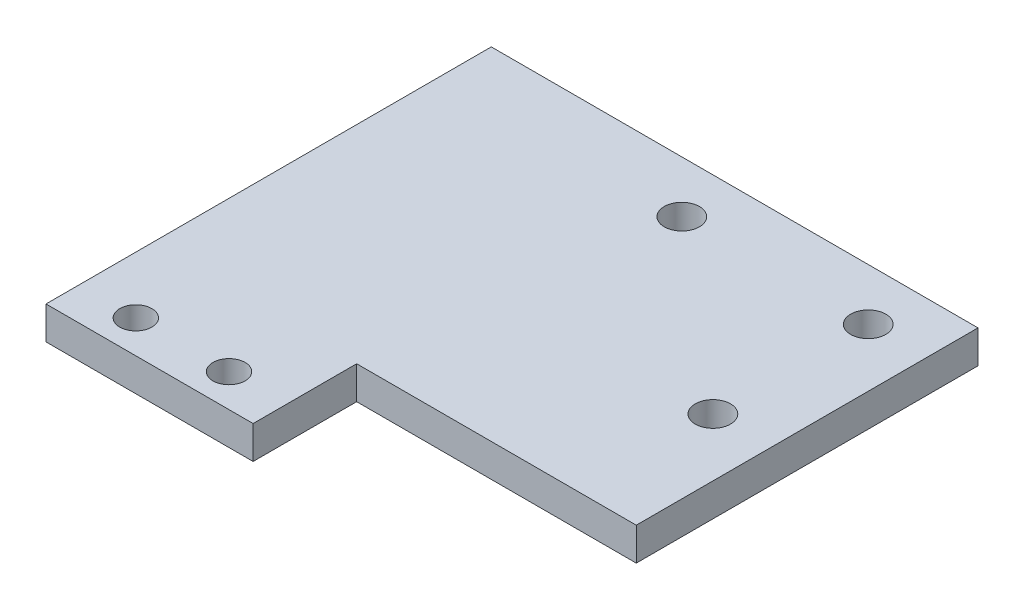
ISO-10303-21;
HEADER;
FILE_DESCRIPTION(('STEP AP214'),'2;1');
FILE_NAME('part.step','',(''),(''),'','','');
FILE_SCHEMA(('AUTOMOTIVE_DESIGN { 1 0 10303 214 1 1 1 1 }'));
ENDSEC;
DATA;
#1=APPLICATION_CONTEXT('core data for automotive mechanical design processes');
#2=APPLICATION_PROTOCOL_DEFINITION('international standard','automotive_design',2000,#1);
#3=PRODUCT_CONTEXT('',#1,'mechanical');
#4=PRODUCT('Part','Part','',(#3));
#5=PRODUCT_RELATED_PRODUCT_CATEGORY('part','',(#4));
#6=PRODUCT_DEFINITION_FORMATION('','',#4);
#7=PRODUCT_DEFINITION_CONTEXT('part definition',#1,'design');
#8=PRODUCT_DEFINITION('design','',#6,#7);
#9=PRODUCT_DEFINITION_SHAPE('','',#8);
#10=(LENGTH_UNIT() NAMED_UNIT(*) SI_UNIT(.MILLI.,.METRE.));
#11=(NAMED_UNIT(*) PLANE_ANGLE_UNIT() SI_UNIT($,.RADIAN.));
#12=(NAMED_UNIT(*) SI_UNIT($,.STERADIAN.) SOLID_ANGLE_UNIT());
#13=UNCERTAINTY_MEASURE_WITH_UNIT(LENGTH_MEASURE(1.E-05),#10,'distance_accuracy_value','');
#14=(GEOMETRIC_REPRESENTATION_CONTEXT(3) GLOBAL_UNCERTAINTY_ASSIGNED_CONTEXT((#13)) GLOBAL_UNIT_ASSIGNED_CONTEXT((#10,
#11,#12)) REPRESENTATION_CONTEXT('',''));
#15=CARTESIAN_POINT('',(0.,0.,0.));
#16=DIRECTION('',(0.,0.,1.));
#17=DIRECTION('',(1.,0.,0.));
#18=AXIS2_PLACEMENT_3D('',#15,#16,#17);
#19=CARTESIAN_POINT('',(0.,3.175,0.));
#20=DIRECTION('',(0.,-1.,0.));
#21=DIRECTION('',(0.,0.,-1.));
#22=AXIS2_PLACEMENT_3D('',#19,#20,#21);
#23=PLANE('',#22);
#24=DIRECTION('',(1.,0.,0.));
#25=VECTOR('',#24,1.);
#26=CARTESIAN_POINT('',(0.,3.175,0.));
#27=LINE('',#26,#25);
#28=CARTESIAN_POINT('',(0.,3.175,0.));
#29=VERTEX_POINT('',#28);
#30=CARTESIAN_POINT('',(19.9999999999988,3.175,0.));
#31=VERTEX_POINT('',#30);
#32=EDGE_CURVE('E135',#29,#31,#27,.T.);
#33=ORIENTED_EDGE('',*,*,#32,.T.);
#34=DIRECTION('',(0.,0.,-1.));
#35=VECTOR('',#34,1.);
#36=CARTESIAN_POINT('',(19.999999999999,3.175,-10.));
#37=LINE('',#36,#35);
#38=CARTESIAN_POINT('',(19.999999999999,3.175,-10.));
#39=VERTEX_POINT('',#38);
#40=EDGE_CURVE('E93',#31,#39,#37,.T.);
#41=ORIENTED_EDGE('',*,*,#40,.T.);
#42=DIRECTION('',(1.,0.,0.));
#43=VECTOR('',#42,1.);
#44=CARTESIAN_POINT('',(47.,3.175,-10.));
#45=LINE('',#44,#43);
#46=CARTESIAN_POINT('',(47.,3.175,-10.));
#47=VERTEX_POINT('',#46);
#48=EDGE_CURVE('E106',#39,#47,#45,.T.);
#49=ORIENTED_EDGE('',*,*,#48,.T.);
#50=DIRECTION('',(0.,0.,-1.));
#51=VECTOR('',#50,1.);
#52=CARTESIAN_POINT('',(47.,3.175,-43.));
#53=LINE('',#52,#51);
#54=CARTESIAN_POINT('',(47.,3.175,-43.));
#55=VERTEX_POINT('',#54);
#56=EDGE_CURVE('E100',#47,#55,#53,.T.);
#57=ORIENTED_EDGE('',*,*,#56,.T.);
#58=DIRECTION('',(-1.,0.,0.));
#59=VECTOR('',#58,1.);
#60=CARTESIAN_POINT('',(0.,3.175,-43.));
#61=LINE('',#60,#59);
#62=CARTESIAN_POINT('',(0.,3.175,-43.));
#63=VERTEX_POINT('',#62);
#64=EDGE_CURVE('E104',#55,#63,#61,.T.);
#65=ORIENTED_EDGE('',*,*,#64,.T.);
#66=DIRECTION('',(0.,0.,1.));
#67=VECTOR('',#66,1.);
#68=CARTESIAN_POINT('',(0.,3.175,0.));
#69=LINE('',#68,#67);
#70=EDGE_CURVE('E56',#63,#29,#69,.T.);
#71=ORIENTED_EDGE('',*,*,#70,.T.);
#72=EDGE_LOOP('',(#33,#41,#49,#57,#65,#71));
#73=FACE_BOUND('',#72,.T.);
#74=CARTESIAN_POINT('',(41.399999999998,3.175,-23.));
#75=DIRECTION('',(0.,1.,0.));
#76=DIRECTION('',(0.,0.,1.));
#77=AXIS2_PLACEMENT_3D('',#74,#75,#76);
#78=CIRCLE('',#77,1.69999999999997);
#79=CARTESIAN_POINT('',(41.399999999998,3.175,-21.3));
#80=VERTEX_POINT('',#79);
#81=EDGE_CURVE('E128',#80,#80,#78,.T.);
#82=ORIENTED_EDGE('',*,*,#81,.F.);
#83=EDGE_LOOP('',(#82));
#84=FACE_BOUND('',#83,.T.);
#85=CARTESIAN_POINT('',(41.399999999998,3.175,-38.));
#86=DIRECTION('',(0.,1.,0.));
#87=DIRECTION('',(0.,0.,1.));
#88=AXIS2_PLACEMENT_3D('',#85,#86,#87);
#89=CIRCLE('',#88,1.69999999999997);
#90=CARTESIAN_POINT('',(41.399999999998,3.175,-36.3));
#91=VERTEX_POINT('',#90);
#92=EDGE_CURVE('E209',#91,#91,#89,.T.);
#93=ORIENTED_EDGE('',*,*,#92,.F.);
#94=EDGE_LOOP('',(#93));
#95=FACE_BOUND('',#94,.T.);
#96=CARTESIAN_POINT('',(23.3999999999979,3.175,-38.));
#97=DIRECTION('',(0.,1.,0.));
#98=DIRECTION('',(0.,0.,1.));
#99=AXIS2_PLACEMENT_3D('',#96,#97,#98);
#100=CIRCLE('',#99,1.69999999999997);
#101=CARTESIAN_POINT('',(23.3999999999979,3.175,-36.3));
#102=VERTEX_POINT('',#101);
#103=EDGE_CURVE('E203',#102,#102,#100,.T.);
#104=ORIENTED_EDGE('',*,*,#103,.F.);
#105=EDGE_LOOP('',(#104));
#106=FACE_BOUND('',#105,.T.);
#107=CARTESIAN_POINT('',(14.4999999999994,3.175,-3.175));
#108=DIRECTION('',(0.,1.,0.));
#109=DIRECTION('',(0.,0.,1.));
#110=AXIS2_PLACEMENT_3D('',#107,#108,#109);
#111=CIRCLE('',#110,1.55);
#112=CARTESIAN_POINT('',(14.4999999999994,3.175,-1.625));
#113=VERTEX_POINT('',#112);
#114=EDGE_CURVE('E197',#113,#113,#111,.T.);
#115=ORIENTED_EDGE('',*,*,#114,.F.);
#116=EDGE_LOOP('',(#115));
#117=FACE_BOUND('',#116,.T.);
#118=CARTESIAN_POINT('',(5.49999999999938,3.175,-3.175));
#119=DIRECTION('',(0.,1.,0.));
#120=DIRECTION('',(0.,0.,1.));
#121=AXIS2_PLACEMENT_3D('',#118,#119,#120);
#122=CIRCLE('',#121,1.55);
#123=CARTESIAN_POINT('',(5.49999999999938,3.175,-1.625));
#124=VERTEX_POINT('',#123);
#125=EDGE_CURVE('E188',#124,#124,#122,.T.);
#126=ORIENTED_EDGE('',*,*,#125,.F.);
#127=EDGE_LOOP('',(#126));
#128=FACE_BOUND('',#127,.T.);
#129=ADVANCED_FACE('F39',(#73,#84,#95,#106,#117,#128),#23,.F.);
#130=CARTESIAN_POINT('',(0.,0.,0.));
#131=DIRECTION('',(0.,-1.,0.));
#132=DIRECTION('',(0.,0.,-1.));
#133=AXIS2_PLACEMENT_3D('',#130,#131,#132);
#134=PLANE('',#133);
#135=CARTESIAN_POINT('',(14.4999999999994,0.,-3.175));
#136=DIRECTION('',(0.,1.,0.));
#137=DIRECTION('',(0.,0.,1.));
#138=AXIS2_PLACEMENT_3D('',#135,#136,#137);
#139=CIRCLE('',#138,1.55);
#140=CARTESIAN_POINT('',(14.4999999999994,0.,-1.625));
#141=VERTEX_POINT('',#140);
#142=EDGE_CURVE('E194',#141,#141,#139,.T.);
#143=ORIENTED_EDGE('',*,*,#142,.T.);
#144=EDGE_LOOP('',(#143));
#145=FACE_BOUND('',#144,.T.);
#146=CARTESIAN_POINT('',(41.399999999998,0.,-38.));
#147=DIRECTION('',(0.,1.,0.));
#148=DIRECTION('',(0.,0.,1.));
#149=AXIS2_PLACEMENT_3D('',#146,#147,#148);
#150=CIRCLE('',#149,1.69999999999997);
#151=CARTESIAN_POINT('',(41.399999999998,0.,-36.3));
#152=VERTEX_POINT('',#151);
#153=EDGE_CURVE('E206',#152,#152,#150,.T.);
#154=ORIENTED_EDGE('',*,*,#153,.T.);
#155=EDGE_LOOP('',(#154));
#156=FACE_BOUND('',#155,.T.);
#157=DIRECTION('',(1.,0.,0.));
#158=VECTOR('',#157,1.);
#159=CARTESIAN_POINT('',(0.,0.,0.));
#160=LINE('',#159,#158);
#161=CARTESIAN_POINT('',(0.,0.,0.));
#162=VERTEX_POINT('',#161);
#163=CARTESIAN_POINT('',(19.9999999999988,0.,0.));
#164=VERTEX_POINT('',#163);
#165=EDGE_CURVE('E124',#162,#164,#160,.T.);
#166=ORIENTED_EDGE('',*,*,#165,.F.);
#167=DIRECTION('',(0.,0.,1.));
#168=VECTOR('',#167,1.);
#169=CARTESIAN_POINT('',(0.,0.,0.));
#170=LINE('',#169,#168);
#171=CARTESIAN_POINT('',(0.,0.,-43.));
#172=VERTEX_POINT('',#171);
#173=EDGE_CURVE('E85',#172,#162,#170,.T.);
#174=ORIENTED_EDGE('',*,*,#173,.F.);
#175=DIRECTION('',(-1.,0.,0.));
#176=VECTOR('',#175,1.);
#177=CARTESIAN_POINT('',(0.,0.,-43.));
#178=LINE('',#177,#176);
#179=CARTESIAN_POINT('',(47.,0.,-43.));
#180=VERTEX_POINT('',#179);
#181=EDGE_CURVE('E79',#180,#172,#178,.T.);
#182=ORIENTED_EDGE('',*,*,#181,.F.);
#183=DIRECTION('',(0.,0.,-1.));
#184=VECTOR('',#183,1.);
#185=CARTESIAN_POINT('',(47.,0.,-43.));
#186=LINE('',#185,#184);
#187=CARTESIAN_POINT('',(47.,0.,-10.));
#188=VERTEX_POINT('',#187);
#189=EDGE_CURVE('E114',#188,#180,#186,.T.);
#190=ORIENTED_EDGE('',*,*,#189,.F.);
#191=DIRECTION('',(1.,0.,0.));
#192=VECTOR('',#191,1.);
#193=CARTESIAN_POINT('',(47.,0.,-10.));
#194=LINE('',#193,#192);
#195=CARTESIAN_POINT('',(19.999999999999,0.,-10.));
#196=VERTEX_POINT('',#195);
#197=EDGE_CURVE('E130',#196,#188,#194,.T.);
#198=ORIENTED_EDGE('',*,*,#197,.F.);
#199=DIRECTION('',(0.,0.,-1.));
#200=VECTOR('',#199,1.);
#201=CARTESIAN_POINT('',(19.999999999999,0.,-10.));
#202=LINE('',#201,#200);
#203=EDGE_CURVE('E127',#164,#196,#202,.T.);
#204=ORIENTED_EDGE('',*,*,#203,.F.);
#205=EDGE_LOOP('',(#166,#174,#182,#190,#198,#204));
#206=FACE_BOUND('',#205,.T.);
#207=CARTESIAN_POINT('',(41.399999999998,0.,-23.));
#208=DIRECTION('',(0.,1.,0.));
#209=DIRECTION('',(0.,0.,1.));
#210=AXIS2_PLACEMENT_3D('',#207,#208,#209);
#211=CIRCLE('',#210,1.69999999999997);
#212=CARTESIAN_POINT('',(41.399999999998,0.,-21.3));
#213=VERTEX_POINT('',#212);
#214=EDGE_CURVE('E212',#213,#213,#211,.T.);
#215=ORIENTED_EDGE('',*,*,#214,.T.);
#216=EDGE_LOOP('',(#215));
#217=FACE_BOUND('',#216,.T.);
#218=CARTESIAN_POINT('',(23.3999999999979,0.,-38.));
#219=DIRECTION('',(0.,1.,0.));
#220=DIRECTION('',(0.,0.,1.));
#221=AXIS2_PLACEMENT_3D('',#218,#219,#220);
#222=CIRCLE('',#221,1.69999999999997);
#223=CARTESIAN_POINT('',(23.3999999999979,0.,-36.3));
#224=VERTEX_POINT('',#223);
#225=EDGE_CURVE('E200',#224,#224,#222,.T.);
#226=ORIENTED_EDGE('',*,*,#225,.T.);
#227=EDGE_LOOP('',(#226));
#228=FACE_BOUND('',#227,.T.);
#229=CARTESIAN_POINT('',(5.49999999999938,0.,-3.175));
#230=DIRECTION('',(0.,1.,0.));
#231=DIRECTION('',(0.,0.,1.));
#232=AXIS2_PLACEMENT_3D('',#229,#230,#231);
#233=CIRCLE('',#232,1.55);
#234=CARTESIAN_POINT('',(5.49999999999938,0.,-1.625));
#235=VERTEX_POINT('',#234);
#236=EDGE_CURVE('E191',#235,#235,#233,.T.);
#237=ORIENTED_EDGE('',*,*,#236,.T.);
#238=EDGE_LOOP('',(#237));
#239=FACE_BOUND('',#238,.T.);
#240=ADVANCED_FACE('F144',(#145,#156,#206,#217,#228,#239),#134,.T.);
#241=CARTESIAN_POINT('',(0.,3.175,0.));
#242=DIRECTION('',(0.,0.,-1.));
#243=DIRECTION('',(-1.,0.,0.));
#244=AXIS2_PLACEMENT_3D('',#241,#242,#243);
#245=PLANE('',#244);
#246=ORIENTED_EDGE('',*,*,#165,.T.);
#247=DIRECTION('',(0.,-1.,0.));
#248=VECTOR('',#247,1.);
#249=CARTESIAN_POINT('',(19.9999999999988,3.175,0.));
#250=LINE('',#249,#248);
#251=EDGE_CURVE('E11',#31,#164,#250,.T.);
#252=ORIENTED_EDGE('',*,*,#251,.F.);
#253=ORIENTED_EDGE('',*,*,#32,.F.);
#254=DIRECTION('',(0.,-1.,0.));
#255=VECTOR('',#254,1.);
#256=CARTESIAN_POINT('',(0.,3.175,0.));
#257=LINE('',#256,#255);
#258=EDGE_CURVE('E120',#29,#162,#257,.T.);
#259=ORIENTED_EDGE('',*,*,#258,.T.);
#260=EDGE_LOOP('',(#246,#252,#253,#259));
#261=FACE_BOUND('',#260,.T.);
#262=ADVANCED_FACE('F41',(#261),#245,.F.);
#263=CARTESIAN_POINT('',(19.999999999999,3.175,-10.));
#264=DIRECTION('',(-1.,0.,0.));
#265=DIRECTION('',(0.,0.,1.));
#266=AXIS2_PLACEMENT_3D('',#263,#264,#265);
#267=PLANE('',#266);
#268=ORIENTED_EDGE('',*,*,#203,.T.);
#269=DIRECTION('',(0.,-1.,0.));
#270=VECTOR('',#269,1.);
#271=CARTESIAN_POINT('',(19.999999999999,3.175,-10.));
#272=LINE('',#271,#270);
#273=EDGE_CURVE('E48',#39,#196,#272,.T.);
#274=ORIENTED_EDGE('',*,*,#273,.F.);
#275=ORIENTED_EDGE('',*,*,#40,.F.);
#276=ORIENTED_EDGE('',*,*,#251,.T.);
#277=EDGE_LOOP('',(#268,#274,#275,#276));
#278=FACE_BOUND('',#277,.T.);
#279=ADVANCED_FACE('F285',(#278),#267,.F.);
#280=CARTESIAN_POINT('',(47.,3.175,-10.));
#281=DIRECTION('',(0.,0.,-1.));
#282=DIRECTION('',(-1.,0.,0.));
#283=AXIS2_PLACEMENT_3D('',#280,#281,#282);
#284=PLANE('',#283);
#285=ORIENTED_EDGE('',*,*,#197,.T.);
#286=DIRECTION('',(0.,-1.,0.));
#287=VECTOR('',#286,1.);
#288=CARTESIAN_POINT('',(47.,3.175,-10.));
#289=LINE('',#288,#287);
#290=EDGE_CURVE('E115',#47,#188,#289,.T.);
#291=ORIENTED_EDGE('',*,*,#290,.F.);
#292=ORIENTED_EDGE('',*,*,#48,.F.);
#293=ORIENTED_EDGE('',*,*,#273,.T.);
#294=EDGE_LOOP('',(#285,#291,#292,#293));
#295=FACE_BOUND('',#294,.T.);
#296=ADVANCED_FACE('F141',(#295),#284,.F.);
#297=CARTESIAN_POINT('',(47.,3.175,-43.));
#298=DIRECTION('',(-1.,0.,0.));
#299=DIRECTION('',(0.,0.,1.));
#300=AXIS2_PLACEMENT_3D('',#297,#298,#299);
#301=PLANE('',#300);
#302=ORIENTED_EDGE('',*,*,#189,.T.);
#303=DIRECTION('',(0.,-1.,0.));
#304=VECTOR('',#303,1.);
#305=CARTESIAN_POINT('',(47.,3.175,-43.));
#306=LINE('',#305,#304);
#307=EDGE_CURVE('E111',#55,#180,#306,.T.);
#308=ORIENTED_EDGE('',*,*,#307,.F.);
#309=ORIENTED_EDGE('',*,*,#56,.F.);
#310=ORIENTED_EDGE('',*,*,#290,.T.);
#311=EDGE_LOOP('',(#302,#308,#309,#310));
#312=FACE_BOUND('',#311,.T.);
#313=ADVANCED_FACE('F112',(#312),#301,.F.);
#314=CARTESIAN_POINT('',(0.,3.175,-43.));
#315=DIRECTION('',(0.,0.,1.));
#316=DIRECTION('',(1.,0.,0.));
#317=AXIS2_PLACEMENT_3D('',#314,#315,#316);
#318=PLANE('',#317);
#319=ORIENTED_EDGE('',*,*,#181,.T.);
#320=DIRECTION('',(0.,-1.,0.));
#321=VECTOR('',#320,1.);
#322=CARTESIAN_POINT('',(0.,3.175,-43.));
#323=LINE('',#322,#321);
#324=EDGE_CURVE('E116',#63,#172,#323,.T.);
#325=ORIENTED_EDGE('',*,*,#324,.F.);
#326=ORIENTED_EDGE('',*,*,#64,.F.);
#327=ORIENTED_EDGE('',*,*,#307,.T.);
#328=EDGE_LOOP('',(#319,#325,#326,#327));
#329=FACE_BOUND('',#328,.T.);
#330=ADVANCED_FACE('F118',(#329),#318,.F.);
#331=CARTESIAN_POINT('',(0.,3.175,0.));
#332=DIRECTION('',(1.,0.,0.));
#333=DIRECTION('',(0.,0.,-1.));
#334=AXIS2_PLACEMENT_3D('',#331,#332,#333);
#335=PLANE('',#334);
#336=ORIENTED_EDGE('',*,*,#173,.T.);
#337=ORIENTED_EDGE('',*,*,#258,.F.);
#338=ORIENTED_EDGE('',*,*,#70,.F.);
#339=ORIENTED_EDGE('',*,*,#324,.T.);
#340=EDGE_LOOP('',(#336,#337,#338,#339));
#341=FACE_BOUND('',#340,.T.);
#342=ADVANCED_FACE('F149',(#341),#335,.F.);
#343=CARTESIAN_POINT('',(41.399999999998,3.175,-23.));
#344=DIRECTION('',(0.,-1.,0.));
#345=DIRECTION('',(0.,0.,-1.));
#346=AXIS2_PLACEMENT_3D('',#343,#344,#345);
#347=CYLINDRICAL_SURFACE('',#346,1.69999999999997);
#348=ORIENTED_EDGE('',*,*,#81,.T.);
#349=EDGE_LOOP('',(#348));
#350=FACE_BOUND('',#349,.T.);
#351=ORIENTED_EDGE('',*,*,#214,.F.);
#352=EDGE_LOOP('',(#351));
#353=FACE_BOUND('',#352,.T.);
#354=ADVANCED_FACE('F151',(#350,#353),#347,.F.);
#355=CARTESIAN_POINT('',(41.399999999998,3.175,-38.));
#356=DIRECTION('',(0.,-1.,0.));
#357=DIRECTION('',(0.,0.,-1.));
#358=AXIS2_PLACEMENT_3D('',#355,#356,#357);
#359=CYLINDRICAL_SURFACE('',#358,1.69999999999997);
#360=ORIENTED_EDGE('',*,*,#92,.T.);
#361=EDGE_LOOP('',(#360));
#362=FACE_BOUND('',#361,.T.);
#363=ORIENTED_EDGE('',*,*,#153,.F.);
#364=EDGE_LOOP('',(#363));
#365=FACE_BOUND('',#364,.T.);
#366=ADVANCED_FACE('F157',(#362,#365),#359,.F.);
#367=CARTESIAN_POINT('',(23.3999999999979,3.175,-38.));
#368=DIRECTION('',(0.,-1.,0.));
#369=DIRECTION('',(0.,0.,-1.));
#370=AXIS2_PLACEMENT_3D('',#367,#368,#369);
#371=CYLINDRICAL_SURFACE('',#370,1.69999999999997);
#372=ORIENTED_EDGE('',*,*,#103,.T.);
#373=EDGE_LOOP('',(#372));
#374=FACE_BOUND('',#373,.T.);
#375=ORIENTED_EDGE('',*,*,#225,.F.);
#376=EDGE_LOOP('',(#375));
#377=FACE_BOUND('',#376,.T.);
#378=ADVANCED_FACE('F171',(#374,#377),#371,.F.);
#379=CARTESIAN_POINT('',(14.4999999999994,3.175,-3.175));
#380=DIRECTION('',(0.,-1.,0.));
#381=DIRECTION('',(0.,0.,-1.));
#382=AXIS2_PLACEMENT_3D('',#379,#380,#381);
#383=CYLINDRICAL_SURFACE('',#382,1.55);
#384=ORIENTED_EDGE('',*,*,#114,.T.);
#385=EDGE_LOOP('',(#384));
#386=FACE_BOUND('',#385,.T.);
#387=ORIENTED_EDGE('',*,*,#142,.F.);
#388=EDGE_LOOP('',(#387));
#389=FACE_BOUND('',#388,.T.);
#390=ADVANCED_FACE('F175',(#386,#389),#383,.F.);
#391=CARTESIAN_POINT('',(5.49999999999938,3.175,-3.175));
#392=DIRECTION('',(0.,-1.,0.));
#393=DIRECTION('',(0.,0.,-1.));
#394=AXIS2_PLACEMENT_3D('',#391,#392,#393);
#395=CYLINDRICAL_SURFACE('',#394,1.55);
#396=ORIENTED_EDGE('',*,*,#125,.T.);
#397=EDGE_LOOP('',(#396));
#398=FACE_BOUND('',#397,.T.);
#399=ORIENTED_EDGE('',*,*,#236,.F.);
#400=EDGE_LOOP('',(#399));
#401=FACE_BOUND('',#400,.T.);
#402=ADVANCED_FACE('F179',(#398,#401),#395,.F.);
#403=CLOSED_SHELL('',(#129,#240,#262,#279,#296,#313,#330,#342,#354,#366,#378,#390,#402));
#404=MANIFOLD_SOLID_BREP('B2',#403);
#405=ADVANCED_BREP_SHAPE_REPRESENTATION('',(#18,#404),#14);
#406=SHAPE_DEFINITION_REPRESENTATION(#9,#405);
ENDSEC;
END-ISO-10303-21;
